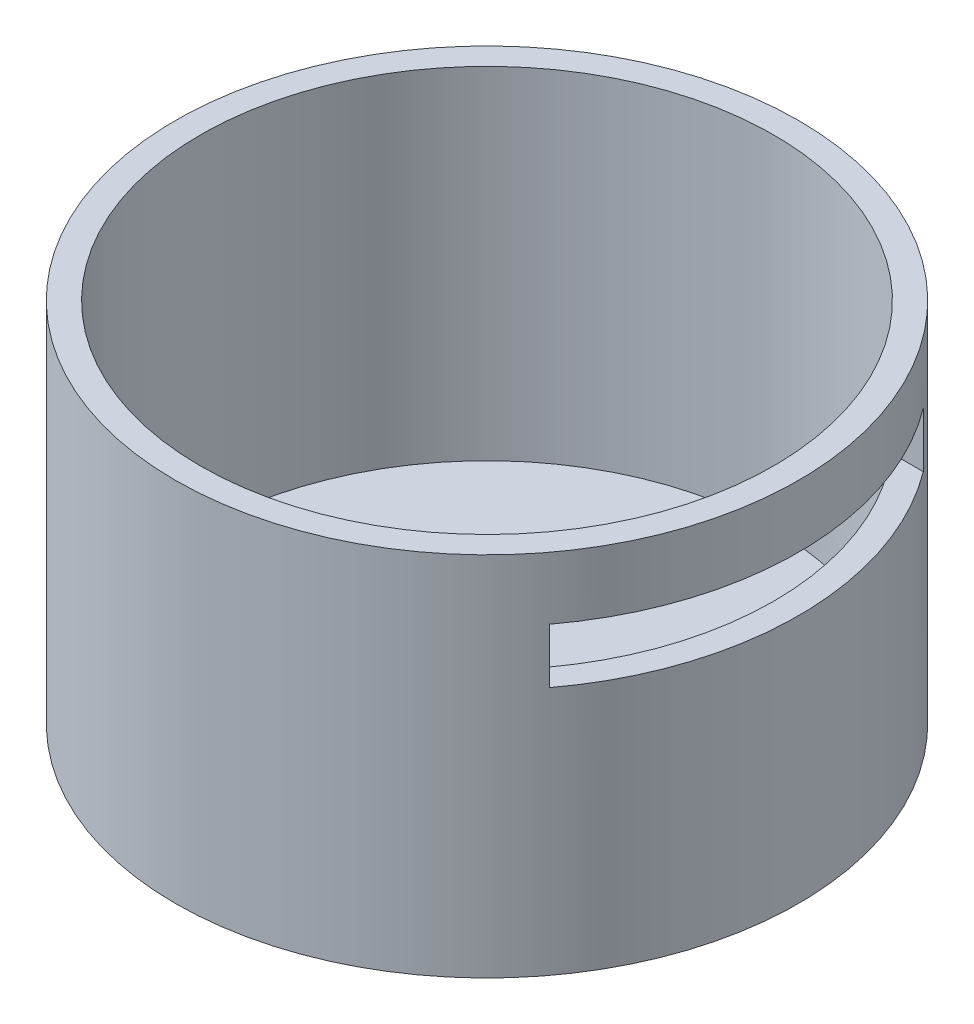
ISO-10303-21;
HEADER;
FILE_DESCRIPTION(('STEP AP214'),'2;1');
FILE_NAME('part.step','',(''),(''),'','','');
FILE_SCHEMA(('AUTOMOTIVE_DESIGN { 1 0 10303 214 1 1 1 1 }'));
ENDSEC;
DATA;
#1=APPLICATION_CONTEXT('core data for automotive mechanical design processes');
#2=APPLICATION_PROTOCOL_DEFINITION('international standard','automotive_design',2000,#1);
#3=PRODUCT_CONTEXT('',#1,'mechanical');
#4=PRODUCT('Part','Part','',(#3));
#5=PRODUCT_RELATED_PRODUCT_CATEGORY('part','',(#4));
#6=PRODUCT_DEFINITION_FORMATION('','',#4);
#7=PRODUCT_DEFINITION_CONTEXT('part definition',#1,'design');
#8=PRODUCT_DEFINITION('design','',#6,#7);
#9=PRODUCT_DEFINITION_SHAPE('','',#8);
#10=(LENGTH_UNIT() NAMED_UNIT(*) SI_UNIT(.MILLI.,.METRE.));
#11=(NAMED_UNIT(*) PLANE_ANGLE_UNIT() SI_UNIT($,.RADIAN.));
#12=(NAMED_UNIT(*) SI_UNIT($,.STERADIAN.) SOLID_ANGLE_UNIT());
#13=UNCERTAINTY_MEASURE_WITH_UNIT(LENGTH_MEASURE(1.E-05),#10,'distance_accuracy_value','');
#14=(GEOMETRIC_REPRESENTATION_CONTEXT(3) GLOBAL_UNCERTAINTY_ASSIGNED_CONTEXT((#13)) GLOBAL_UNIT_ASSIGNED_CONTEXT((#10,
#11,#12)) REPRESENTATION_CONTEXT('',''));
#15=CARTESIAN_POINT('',(0.,0.,0.));
#16=DIRECTION('',(0.,0.,1.));
#17=DIRECTION('',(1.,0.,0.));
#18=AXIS2_PLACEMENT_3D('',#15,#16,#17);
#19=CARTESIAN_POINT('',(0.,14.7,0.));
#20=DIRECTION('',(0.,-1.,0.));
#21=DIRECTION('',(0.,0.,-1.));
#22=AXIS2_PLACEMENT_3D('',#19,#20,#21);
#23=CYLINDRICAL_SURFACE('',#22,12.5);
#24=CARTESIAN_POINT('',(0.,0.,0.));
#25=DIRECTION('',(0.,1.,0.));
#26=DIRECTION('',(0.,0.,1.));
#27=AXIS2_PLACEMENT_3D('',#24,#25,#26);
#28=CIRCLE('',#27,12.5);
#29=CARTESIAN_POINT('',(0.,0.,12.5));
#30=VERTEX_POINT('',#29);
#31=EDGE_CURVE('E99',#30,#30,#28,.T.);
#32=ORIENTED_EDGE('',*,*,#31,.T.);
#33=EDGE_LOOP('',(#32));
#34=FACE_BOUND('',#33,.T.);
#35=CARTESIAN_POINT('',(0.,14.7,0.));
#36=DIRECTION('',(0.,1.,0.));
#37=DIRECTION('',(0.,0.,1.));
#38=AXIS2_PLACEMENT_3D('',#35,#36,#37);
#39=CIRCLE('',#38,12.5);
#40=CARTESIAN_POINT('',(0.,14.7,12.5));
#41=VERTEX_POINT('',#40);
#42=EDGE_CURVE('E100',#41,#41,#39,.T.);
#43=ORIENTED_EDGE('',*,*,#42,.F.);
#44=EDGE_LOOP('',(#43));
#45=FACE_BOUND('',#44,.T.);
#46=DIRECTION('',(0.,-1.,0.));
#47=VECTOR('',#46,1.);
#48=CARTESIAN_POINT('',(10.,14.7,7.5));
#49=LINE('',#48,#47);
#50=CARTESIAN_POINT('',(10.,12.2,7.5));
#51=VERTEX_POINT('',#50);
#52=CARTESIAN_POINT('',(10.,10.,7.5));
#53=VERTEX_POINT('',#52);
#54=EDGE_CURVE('E83',#51,#53,#49,.T.);
#55=ORIENTED_EDGE('',*,*,#54,.F.);
#56=CARTESIAN_POINT('',(0.,12.2,0.));
#57=DIRECTION('',(0.,-1.,0.));
#58=DIRECTION('',(0.,0.,-1.));
#59=AXIS2_PLACEMENT_3D('',#56,#57,#58);
#60=CIRCLE('',#59,12.5);
#61=CARTESIAN_POINT('',(10.,12.2,-7.5));
#62=VERTEX_POINT('',#61);
#63=EDGE_CURVE('E72',#62,#51,#60,.T.);
#64=ORIENTED_EDGE('',*,*,#63,.F.);
#65=DIRECTION('',(0.,-1.,0.));
#66=VECTOR('',#65,1.);
#67=CARTESIAN_POINT('',(10.,14.7,-7.5));
#68=LINE('',#67,#66);
#69=CARTESIAN_POINT('',(10.,10.,-7.5));
#70=VERTEX_POINT('',#69);
#71=EDGE_CURVE('E77',#70,#62,#68,.F.);
#72=ORIENTED_EDGE('',*,*,#71,.F.);
#73=CARTESIAN_POINT('',(0.,10.,0.));
#74=DIRECTION('',(0.,1.,0.));
#75=DIRECTION('',(0.,0.,1.));
#76=AXIS2_PLACEMENT_3D('',#73,#74,#75);
#77=CIRCLE('',#76,12.5);
#78=EDGE_CURVE('E88',#53,#70,#77,.T.);
#79=ORIENTED_EDGE('',*,*,#78,.F.);
#80=EDGE_LOOP('',(#55,#64,#72,#79));
#81=FACE_BOUND('',#80,.T.);
#82=ADVANCED_FACE('F35',(#34,#45,#81),#23,.T.);
#83=CARTESIAN_POINT('',(0.,14.7,0.));
#84=DIRECTION('',(0.,-1.,0.));
#85=DIRECTION('',(0.,0.,-1.));
#86=AXIS2_PLACEMENT_3D('',#83,#84,#85);
#87=CYLINDRICAL_SURFACE('',#86,11.5);
#88=CARTESIAN_POINT('',(0.,0.999999999999999,0.));
#89=DIRECTION('',(0.,1.,0.));
#90=DIRECTION('',(0.,0.,1.));
#91=AXIS2_PLACEMENT_3D('',#88,#89,#90);
#92=CIRCLE('',#91,11.5);
#93=CARTESIAN_POINT('',(0.,0.999999999999999,11.5));
#94=VERTEX_POINT('',#93);
#95=EDGE_CURVE('E89',#94,#94,#92,.T.);
#96=ORIENTED_EDGE('',*,*,#95,.F.);
#97=EDGE_LOOP('',(#96));
#98=FACE_BOUND('',#97,.T.);
#99=CARTESIAN_POINT('',(0.,14.7,0.));
#100=DIRECTION('',(0.,1.,0.));
#101=DIRECTION('',(0.,0.,1.));
#102=AXIS2_PLACEMENT_3D('',#99,#100,#101);
#103=CIRCLE('',#102,11.5);
#104=CARTESIAN_POINT('',(0.,14.7,11.5));
#105=VERTEX_POINT('',#104);
#106=EDGE_CURVE('E92',#105,#105,#103,.T.);
#107=ORIENTED_EDGE('',*,*,#106,.T.);
#108=EDGE_LOOP('',(#107));
#109=FACE_BOUND('',#108,.T.);
#110=CARTESIAN_POINT('',(0.,12.2,0.));
#111=DIRECTION('',(0.,-1.,0.));
#112=DIRECTION('',(0.,0.,-1.));
#113=AXIS2_PLACEMENT_3D('',#110,#111,#112);
#114=CIRCLE('',#113,11.5);
#115=CARTESIAN_POINT('',(8.71779788708135,12.2,-7.5));
#116=VERTEX_POINT('',#115);
#117=CARTESIAN_POINT('',(8.71779788708134,12.2,7.5));
#118=VERTEX_POINT('',#117);
#119=EDGE_CURVE('E103',#116,#118,#114,.T.);
#120=ORIENTED_EDGE('',*,*,#119,.T.);
#121=DIRECTION('',(0.,-1.,0.));
#122=VECTOR('',#121,1.);
#123=CARTESIAN_POINT('',(8.71779788708134,14.7,7.5));
#124=LINE('',#123,#122);
#125=CARTESIAN_POINT('',(8.71779788708134,10.,7.5));
#126=VERTEX_POINT('',#125);
#127=EDGE_CURVE('E11',#118,#126,#124,.T.);
#128=ORIENTED_EDGE('',*,*,#127,.T.);
#129=CARTESIAN_POINT('',(0.,10.,0.));
#130=DIRECTION('',(0.,1.,0.));
#131=DIRECTION('',(0.,0.,1.));
#132=AXIS2_PLACEMENT_3D('',#129,#130,#131);
#133=CIRCLE('',#132,11.5);
#134=CARTESIAN_POINT('',(8.71779788708135,10.,-7.5));
#135=VERTEX_POINT('',#134);
#136=EDGE_CURVE('E42',#126,#135,#133,.T.);
#137=ORIENTED_EDGE('',*,*,#136,.T.);
#138=DIRECTION('',(0.,-1.,0.));
#139=VECTOR('',#138,1.);
#140=CARTESIAN_POINT('',(8.71779788708135,14.7,-7.5));
#141=LINE('',#140,#139);
#142=EDGE_CURVE('E107',#135,#116,#141,.F.);
#143=ORIENTED_EDGE('',*,*,#142,.T.);
#144=EDGE_LOOP('',(#120,#128,#137,#143));
#145=FACE_BOUND('',#144,.T.);
#146=ADVANCED_FACE('F111',(#98,#109,#145),#87,.F.);
#147=CARTESIAN_POINT('',(0.,14.7,0.));
#148=DIRECTION('',(0.,1.,0.));
#149=DIRECTION('',(0.,0.,1.));
#150=AXIS2_PLACEMENT_3D('',#147,#148,#149);
#151=PLANE('',#150);
#152=ORIENTED_EDGE('',*,*,#106,.F.);
#153=EDGE_LOOP('',(#152));
#154=FACE_BOUND('',#153,.T.);
#155=ORIENTED_EDGE('',*,*,#42,.T.);
#156=EDGE_LOOP('',(#155));
#157=FACE_BOUND('',#156,.T.);
#158=ADVANCED_FACE('F135',(#154,#157),#151,.T.);
#159=CARTESIAN_POINT('',(0.,0.,0.));
#160=DIRECTION('',(0.,1.,0.));
#161=DIRECTION('',(0.,0.,1.));
#162=AXIS2_PLACEMENT_3D('',#159,#160,#161);
#163=PLANE('',#162);
#164=ORIENTED_EDGE('',*,*,#31,.F.);
#165=EDGE_LOOP('',(#164));
#166=FACE_BOUND('',#165,.T.);
#167=ADVANCED_FACE('F143',(#166),#163,.F.);
#168=CARTESIAN_POINT('',(0.,1.,0.));
#169=DIRECTION('',(0.,1.,0.));
#170=DIRECTION('',(0.,0.,1.));
#171=AXIS2_PLACEMENT_3D('',#168,#169,#170);
#172=PLANE('',#171);
#173=ORIENTED_EDGE('',*,*,#95,.T.);
#174=EDGE_LOOP('',(#173));
#175=FACE_BOUND('',#174,.T.);
#176=ADVANCED_FACE('F149',(#175),#172,.T.);
#177=CARTESIAN_POINT('',(24.7,12.2,7.5));
#178=DIRECTION('',(0.,0.,-1.));
#179=DIRECTION('',(0.,1.,0.));
#180=AXIS2_PLACEMENT_3D('',#177,#178,#179);
#181=PLANE('',#180);
#182=ORIENTED_EDGE('',*,*,#54,.T.);
#183=DIRECTION('',(-1.,0.,0.));
#184=VECTOR('',#183,1.);
#185=CARTESIAN_POINT('',(24.7,10.,7.5));
#186=LINE('',#185,#184);
#187=EDGE_CURVE('E78',#53,#126,#186,.T.);
#188=ORIENTED_EDGE('',*,*,#187,.T.);
#189=ORIENTED_EDGE('',*,*,#127,.F.);
#190=DIRECTION('',(-1.,0.,0.));
#191=VECTOR('',#190,1.);
#192=CARTESIAN_POINT('',(24.7,12.2,7.5));
#193=LINE('',#192,#191);
#194=EDGE_CURVE('E54',#51,#118,#193,.T.);
#195=ORIENTED_EDGE('',*,*,#194,.F.);
#196=EDGE_LOOP('',(#182,#188,#189,#195));
#197=FACE_BOUND('',#196,.T.);
#198=ADVANCED_FACE('F81',(#197),#181,.T.);
#199=CARTESIAN_POINT('',(24.7,10.,7.5));
#200=DIRECTION('',(0.,1.,0.));
#201=DIRECTION('',(0.,0.,1.));
#202=AXIS2_PLACEMENT_3D('',#199,#200,#201);
#203=PLANE('',#202);
#204=ORIENTED_EDGE('',*,*,#78,.T.);
#205=DIRECTION('',(-1.,0.,0.));
#206=VECTOR('',#205,1.);
#207=CARTESIAN_POINT('',(24.7,10.,-7.5));
#208=LINE('',#207,#206);
#209=EDGE_CURVE('E116',#70,#135,#208,.T.);
#210=ORIENTED_EDGE('',*,*,#209,.T.);
#211=ORIENTED_EDGE('',*,*,#136,.F.);
#212=ORIENTED_EDGE('',*,*,#187,.F.);
#213=EDGE_LOOP('',(#204,#210,#211,#212));
#214=FACE_BOUND('',#213,.T.);
#215=ADVANCED_FACE('F114',(#214),#203,.T.);
#216=CARTESIAN_POINT('',(24.7,12.2,-7.5));
#217=DIRECTION('',(0.,0.,1.));
#218=DIRECTION('',(0.,-1.,0.));
#219=AXIS2_PLACEMENT_3D('',#216,#217,#218);
#220=PLANE('',#219);
#221=ORIENTED_EDGE('',*,*,#71,.T.);
#222=DIRECTION('',(-1.,0.,0.));
#223=VECTOR('',#222,1.);
#224=CARTESIAN_POINT('',(24.7,12.2,-7.5));
#225=LINE('',#224,#223);
#226=EDGE_CURVE('E49',#62,#116,#225,.T.);
#227=ORIENTED_EDGE('',*,*,#226,.T.);
#228=ORIENTED_EDGE('',*,*,#142,.F.);
#229=ORIENTED_EDGE('',*,*,#209,.F.);
#230=EDGE_LOOP('',(#221,#227,#228,#229));
#231=FACE_BOUND('',#230,.T.);
#232=ADVANCED_FACE('F121',(#231),#220,.T.);
#233=CARTESIAN_POINT('',(24.7,12.2,7.5));
#234=DIRECTION('',(0.,-1.,0.));
#235=DIRECTION('',(0.,0.,-1.));
#236=AXIS2_PLACEMENT_3D('',#233,#234,#235);
#237=PLANE('',#236);
#238=ORIENTED_EDGE('',*,*,#63,.T.);
#239=ORIENTED_EDGE('',*,*,#194,.T.);
#240=ORIENTED_EDGE('',*,*,#119,.F.);
#241=ORIENTED_EDGE('',*,*,#226,.F.);
#242=EDGE_LOOP('',(#238,#239,#240,#241));
#243=FACE_BOUND('',#242,.T.);
#244=ADVANCED_FACE('F73',(#243),#237,.T.);
#245=CLOSED_SHELL('',(#82,#146,#158,#167,#176,#198,#215,#232,#244));
#246=MANIFOLD_SOLID_BREP('B2',#245);
#247=ADVANCED_BREP_SHAPE_REPRESENTATION('',(#18,#246),#14);
#248=SHAPE_DEFINITION_REPRESENTATION(#9,#247);
ENDSEC;
END-ISO-10303-21;
